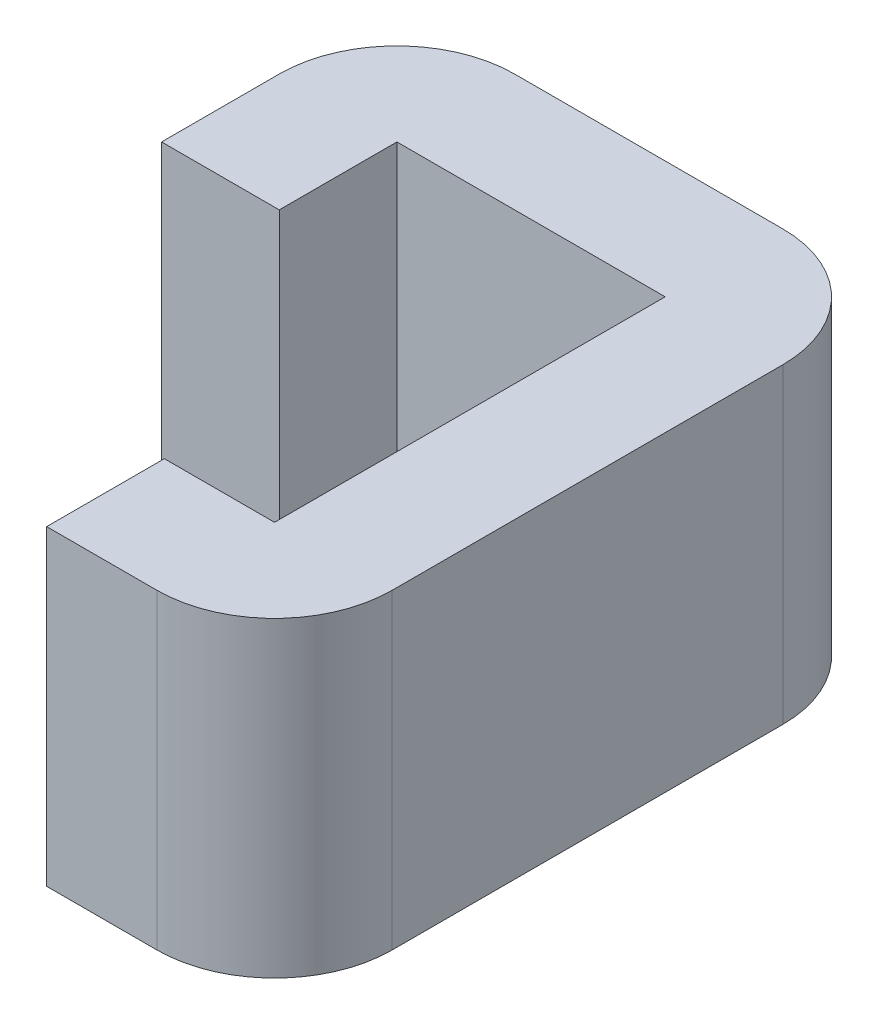
ISO-10303-21;
HEADER;
FILE_DESCRIPTION(('STEP AP214'),'2;1');
FILE_NAME('part.step','',(''),(''),'','','');
FILE_SCHEMA(('AUTOMOTIVE_DESIGN { 1 0 10303 214 1 1 1 1 }'));
ENDSEC;
DATA;
#1=APPLICATION_CONTEXT('core data for automotive mechanical design processes');
#2=APPLICATION_PROTOCOL_DEFINITION('international standard','automotive_design',2000,#1);
#3=PRODUCT_CONTEXT('',#1,'mechanical');
#4=PRODUCT('Part','Part','',(#3));
#5=PRODUCT_RELATED_PRODUCT_CATEGORY('part','',(#4));
#6=PRODUCT_DEFINITION_FORMATION('','',#4);
#7=PRODUCT_DEFINITION_CONTEXT('part definition',#1,'design');
#8=PRODUCT_DEFINITION('design','',#6,#7);
#9=PRODUCT_DEFINITION_SHAPE('','',#8);
#10=(LENGTH_UNIT() NAMED_UNIT(*) SI_UNIT(.MILLI.,.METRE.));
#11=(NAMED_UNIT(*) PLANE_ANGLE_UNIT() SI_UNIT($,.RADIAN.));
#12=(NAMED_UNIT(*) SI_UNIT($,.STERADIAN.) SOLID_ANGLE_UNIT());
#13=UNCERTAINTY_MEASURE_WITH_UNIT(LENGTH_MEASURE(1.E-05),#10,'distance_accuracy_value','');
#14=(GEOMETRIC_REPRESENTATION_CONTEXT(3) GLOBAL_UNCERTAINTY_ASSIGNED_CONTEXT((#13)) GLOBAL_UNIT_ASSIGNED_CONTEXT((#10,
#11,#12)) REPRESENTATION_CONTEXT('',''));
#15=CARTESIAN_POINT('',(0.,0.,0.));
#16=DIRECTION('',(0.,0.,1.));
#17=DIRECTION('',(1.,0.,0.));
#18=AXIS2_PLACEMENT_3D('',#15,#16,#17);
#19=CARTESIAN_POINT('',(0.285,2.236,0.25));
#20=DIRECTION('',(0.,1.,0.));
#21=DIRECTION('',(0.,0.,1.));
#22=AXIS2_PLACEMENT_3D('',#19,#20,#21);
#23=PLANE('',#22);
#24=DIRECTION('',(0.,0.,1.));
#25=VECTOR('',#24,1.);
#26=CARTESIAN_POINT('',(-0.285,2.236,0.5));
#27=LINE('',#26,#25);
#28=CARTESIAN_POINT('',(-0.285,2.236,0.5));
#29=VERTEX_POINT('',#28);
#30=CARTESIAN_POINT('',(-0.285,2.236,0.25));
#31=VERTEX_POINT('',#30);
#32=EDGE_CURVE('E181',#29,#31,#27,.F.);
#33=ORIENTED_EDGE('',*,*,#32,.T.);
#34=DIRECTION('',(-1.,0.,0.));
#35=VECTOR('',#34,1.);
#36=CARTESIAN_POINT('',(-0.285,2.236,0.25));
#37=LINE('',#36,#35);
#38=CARTESIAN_POINT('',(0.285,2.236,0.25));
#39=VERTEX_POINT('',#38);
#40=EDGE_CURVE('E168',#31,#39,#37,.F.);
#41=ORIENTED_EDGE('',*,*,#40,.T.);
#42=DIRECTION('',(0.,0.,-1.));
#43=VECTOR('',#42,1.);
#44=CARTESIAN_POINT('',(0.285,2.236,0.25));
#45=LINE('',#44,#43);
#46=CARTESIAN_POINT('',(0.285,2.236,1.08));
#47=VERTEX_POINT('',#46);
#48=EDGE_CURVE('E158',#39,#47,#45,.F.);
#49=ORIENTED_EDGE('',*,*,#48,.T.);
#50=DIRECTION('',(1.,0.,0.));
#51=VECTOR('',#50,1.);
#52=CARTESIAN_POINT('',(0.285,2.236,1.08));
#53=LINE('',#52,#51);
#54=CARTESIAN_POINT('',(0.0508,2.236,1.08));
#55=VERTEX_POINT('',#54);
#56=EDGE_CURVE('E147',#47,#55,#53,.F.);
#57=ORIENTED_EDGE('',*,*,#56,.T.);
#58=DIRECTION('',(0.,0.,-1.));
#59=VECTOR('',#58,1.);
#60=CARTESIAN_POINT('',(0.0508,2.236,1.08));
#61=LINE('',#60,#59);
#62=CARTESIAN_POINT('',(0.0508,2.236,1.33));
#63=VERTEX_POINT('',#62);
#64=EDGE_CURVE('E122',#55,#63,#61,.F.);
#65=ORIENTED_EDGE('',*,*,#64,.T.);
#66=DIRECTION('',(1.,0.,0.));
#67=VECTOR('',#66,1.);
#68=CARTESIAN_POINT('',(0.285,2.236,1.33));
#69=LINE('',#68,#67);
#70=CARTESIAN_POINT('',(0.285,2.236,1.33));
#71=VERTEX_POINT('',#70);
#72=EDGE_CURVE('E120',#71,#63,#69,.F.);
#73=ORIENTED_EDGE('',*,*,#72,.F.);
#74=CARTESIAN_POINT('',(0.285,2.236,1.08));
#75=DIRECTION('',(0.,-1.,0.));
#76=DIRECTION('',(0.,0.,-1.));
#77=AXIS2_PLACEMENT_3D('',#74,#75,#76);
#78=CIRCLE('',#77,0.25);
#79=CARTESIAN_POINT('',(0.535,2.236,1.08));
#80=VERTEX_POINT('',#79);
#81=EDGE_CURVE('E20',#80,#71,#78,.T.);
#82=ORIENTED_EDGE('',*,*,#81,.F.);
#83=DIRECTION('',(0.,0.,1.));
#84=VECTOR('',#83,1.);
#85=CARTESIAN_POINT('',(0.535,2.236,1.08));
#86=LINE('',#85,#84);
#87=CARTESIAN_POINT('',(0.535,2.236,0.25));
#88=VERTEX_POINT('',#87);
#89=EDGE_CURVE('E131',#80,#88,#86,.F.);
#90=ORIENTED_EDGE('',*,*,#89,.T.);
#91=CARTESIAN_POINT('',(0.285,2.236,0.25));
#92=DIRECTION('',(0.,-1.,0.));
#93=DIRECTION('',(0.,0.,-1.));
#94=AXIS2_PLACEMENT_3D('',#91,#92,#93);
#95=CIRCLE('',#94,0.25);
#96=CARTESIAN_POINT('',(0.285,2.236,0.));
#97=VERTEX_POINT('',#96);
#98=EDGE_CURVE('E212',#97,#88,#95,.T.);
#99=ORIENTED_EDGE('',*,*,#98,.F.);
#100=DIRECTION('',(1.,0.,0.));
#101=VECTOR('',#100,1.);
#102=CARTESIAN_POINT('',(0.285,2.236,0.));
#103=LINE('',#102,#101);
#104=CARTESIAN_POINT('',(-0.285,2.236,0.));
#105=VERTEX_POINT('',#104);
#106=EDGE_CURVE('E207',#97,#105,#103,.F.);
#107=ORIENTED_EDGE('',*,*,#106,.T.);
#108=CARTESIAN_POINT('',(-0.285,2.236,0.25));
#109=DIRECTION('',(0.,-1.,0.));
#110=DIRECTION('',(0.,0.,-1.));
#111=AXIS2_PLACEMENT_3D('',#108,#109,#110);
#112=CIRCLE('',#111,0.25);
#113=CARTESIAN_POINT('',(-0.535,2.236,0.25));
#114=VERTEX_POINT('',#113);
#115=EDGE_CURVE('E210',#114,#105,#112,.T.);
#116=ORIENTED_EDGE('',*,*,#115,.F.);
#117=DIRECTION('',(0.,0.,-1.));
#118=VECTOR('',#117,1.);
#119=CARTESIAN_POINT('',(-0.535,2.236,0.25));
#120=LINE('',#119,#118);
#121=CARTESIAN_POINT('',(-0.535,2.236,0.5));
#122=VERTEX_POINT('',#121);
#123=EDGE_CURVE('E202',#114,#122,#120,.F.);
#124=ORIENTED_EDGE('',*,*,#123,.T.);
#125=DIRECTION('',(-1.,0.,0.));
#126=VECTOR('',#125,1.);
#127=CARTESIAN_POINT('',(-0.535,2.236,0.5));
#128=LINE('',#127,#126);
#129=EDGE_CURVE('E195',#122,#29,#128,.F.);
#130=ORIENTED_EDGE('',*,*,#129,.T.);
#131=EDGE_LOOP('',(#33,#41,#49,#57,#65,#73,#82,#90,#99,#107,#116,#124,#130));
#132=FACE_BOUND('',#131,.T.);
#133=ADVANCED_FACE('F17',(#132),#23,.T.);
#134=CARTESIAN_POINT('',(0.285,1.574,0.25));
#135=DIRECTION('',(1.,0.,0.));
#136=DIRECTION('',(0.,0.,-1.));
#137=AXIS2_PLACEMENT_3D('',#134,#135,#136);
#138=PLANE('',#137);
#139=DIRECTION('',(0.,1.,0.));
#140=VECTOR('',#139,1.);
#141=CARTESIAN_POINT('',(0.285,1.574,1.08));
#142=LINE('',#141,#140);
#143=CARTESIAN_POINT('',(0.285,1.574,1.08));
#144=VERTEX_POINT('',#143);
#145=EDGE_CURVE('E155',#144,#47,#142,.T.);
#146=ORIENTED_EDGE('',*,*,#145,.T.);
#147=ORIENTED_EDGE('',*,*,#48,.F.);
#148=DIRECTION('',(0.,1.,0.));
#149=VECTOR('',#148,1.);
#150=CARTESIAN_POINT('',(0.285,1.574,0.25));
#151=LINE('',#150,#149);
#152=CARTESIAN_POINT('',(0.285,1.574,0.25));
#153=VERTEX_POINT('',#152);
#154=EDGE_CURVE('E163',#39,#153,#151,.F.);
#155=ORIENTED_EDGE('',*,*,#154,.T.);
#156=DIRECTION('',(0.,0.,1.));
#157=VECTOR('',#156,1.);
#158=CARTESIAN_POINT('',(0.285,1.574,0.25));
#159=LINE('',#158,#157);
#160=EDGE_CURVE('E152',#153,#144,#159,.T.);
#161=ORIENTED_EDGE('',*,*,#160,.T.);
#162=EDGE_LOOP('',(#146,#147,#155,#161));
#163=FACE_BOUND('',#162,.T.);
#164=ADVANCED_FACE('F395',(#163),#138,.F.);
#165=CARTESIAN_POINT('',(0.285,1.574,1.08));
#166=DIRECTION('',(0.,0.,1.));
#167=DIRECTION('',(1.,0.,0.));
#168=AXIS2_PLACEMENT_3D('',#165,#166,#167);
#169=PLANE('',#168);
#170=DIRECTION('',(0.,1.,0.));
#171=VECTOR('',#170,1.);
#172=CARTESIAN_POINT('',(0.0508,1.574,1.08));
#173=LINE('',#172,#171);
#174=CARTESIAN_POINT('',(0.0508,1.574,1.08));
#175=VERTEX_POINT('',#174);
#176=EDGE_CURVE('E144',#175,#55,#173,.T.);
#177=ORIENTED_EDGE('',*,*,#176,.T.);
#178=ORIENTED_EDGE('',*,*,#56,.F.);
#179=ORIENTED_EDGE('',*,*,#145,.F.);
#180=DIRECTION('',(1.,0.,0.));
#181=VECTOR('',#180,1.);
#182=CARTESIAN_POINT('',(0.285,1.574,1.08));
#183=LINE('',#182,#181);
#184=EDGE_CURVE('E141',#144,#175,#183,.F.);
#185=ORIENTED_EDGE('',*,*,#184,.T.);
#186=EDGE_LOOP('',(#177,#178,#179,#185));
#187=FACE_BOUND('',#186,.T.);
#188=ADVANCED_FACE('F385',(#187),#169,.F.);
#189=CARTESIAN_POINT('',(0.0508,1.574,1.08));
#190=DIRECTION('',(1.,0.,0.));
#191=DIRECTION('',(0.,0.,-1.));
#192=AXIS2_PLACEMENT_3D('',#189,#190,#191);
#193=PLANE('',#192);
#194=DIRECTION('',(0.,1.,0.));
#195=VECTOR('',#194,1.);
#196=CARTESIAN_POINT('',(0.0508,1.574,1.33));
#197=LINE('',#196,#195);
#198=CARTESIAN_POINT('',(0.0508,1.574,1.33));
#199=VERTEX_POINT('',#198);
#200=EDGE_CURVE('E118',#63,#199,#197,.F.);
#201=ORIENTED_EDGE('',*,*,#200,.F.);
#202=ORIENTED_EDGE('',*,*,#64,.F.);
#203=ORIENTED_EDGE('',*,*,#176,.F.);
#204=DIRECTION('',(0.,0.,1.));
#205=VECTOR('',#204,1.);
#206=CARTESIAN_POINT('',(0.0508,1.574,0.25));
#207=LINE('',#206,#205);
#208=EDGE_CURVE('E138',#175,#199,#207,.T.);
#209=ORIENTED_EDGE('',*,*,#208,.T.);
#210=EDGE_LOOP('',(#201,#202,#203,#209));
#211=FACE_BOUND('',#210,.T.);
#212=ADVANCED_FACE('F376',(#211),#193,.F.);
#213=CARTESIAN_POINT('',(0.285,1.574,1.33));
#214=DIRECTION('',(0.,0.,1.));
#215=DIRECTION('',(1.,0.,0.));
#216=AXIS2_PLACEMENT_3D('',#213,#214,#215);
#217=PLANE('',#216);
#218=ORIENTED_EDGE('',*,*,#200,.T.);
#219=DIRECTION('',(1.,0.,0.));
#220=VECTOR('',#219,1.);
#221=CARTESIAN_POINT('',(0.285,1.574,1.33));
#222=LINE('',#221,#220);
#223=CARTESIAN_POINT('',(0.285,1.574,1.33));
#224=VERTEX_POINT('',#223);
#225=EDGE_CURVE('E129',#199,#224,#222,.T.);
#226=ORIENTED_EDGE('',*,*,#225,.T.);
#227=DIRECTION('',(0.,-1.,0.));
#228=VECTOR('',#227,1.);
#229=CARTESIAN_POINT('',(0.285,1.574,1.33));
#230=LINE('',#229,#228);
#231=EDGE_CURVE('E115',#71,#224,#230,.T.);
#232=ORIENTED_EDGE('',*,*,#231,.F.);
#233=ORIENTED_EDGE('',*,*,#72,.T.);
#234=EDGE_LOOP('',(#218,#226,#232,#233));
#235=FACE_BOUND('',#234,.T.);
#236=ADVANCED_FACE('F127',(#235),#217,.T.);
#237=CARTESIAN_POINT('',(0.285,1.574,1.08));
#238=DIRECTION('',(0.,-1.,0.));
#239=DIRECTION('',(0.,0.,-1.));
#240=AXIS2_PLACEMENT_3D('',#237,#238,#239);
#241=CYLINDRICAL_SURFACE('',#240,0.25);
#242=ORIENTED_EDGE('',*,*,#81,.T.);
#243=ORIENTED_EDGE('',*,*,#231,.T.);
#244=CARTESIAN_POINT('',(0.285,1.574,1.08));
#245=DIRECTION('',(0.,-1.,0.));
#246=DIRECTION('',(0.,0.,-1.));
#247=AXIS2_PLACEMENT_3D('',#244,#245,#246);
#248=CIRCLE('',#247,0.25);
#249=CARTESIAN_POINT('',(0.535,1.574,1.08));
#250=VERTEX_POINT('',#249);
#251=EDGE_CURVE('E231',#224,#250,#248,.F.);
#252=ORIENTED_EDGE('',*,*,#251,.T.);
#253=DIRECTION('',(0.,1.,0.));
#254=VECTOR('',#253,1.);
#255=CARTESIAN_POINT('',(0.535,1.574,1.08));
#256=LINE('',#255,#254);
#257=EDGE_CURVE('E117',#250,#80,#256,.T.);
#258=ORIENTED_EDGE('',*,*,#257,.T.);
#259=EDGE_LOOP('',(#242,#243,#252,#258));
#260=FACE_BOUND('',#259,.T.);
#261=ADVANCED_FACE('F112',(#260),#241,.T.);
#262=CARTESIAN_POINT('',(0.535,1.574,1.08));
#263=DIRECTION('',(-1.,0.,0.));
#264=DIRECTION('',(0.,0.,1.));
#265=AXIS2_PLACEMENT_3D('',#262,#263,#264);
#266=PLANE('',#265);
#267=DIRECTION('',(0.,-1.,0.));
#268=VECTOR('',#267,1.);
#269=CARTESIAN_POINT('',(0.535,1.574,0.25));
#270=LINE('',#269,#268);
#271=CARTESIAN_POINT('',(0.535,1.574,0.25));
#272=VERTEX_POINT('',#271);
#273=EDGE_CURVE('E234',#88,#272,#270,.T.);
#274=ORIENTED_EDGE('',*,*,#273,.F.);
#275=ORIENTED_EDGE('',*,*,#89,.F.);
#276=ORIENTED_EDGE('',*,*,#257,.F.);
#277=DIRECTION('',(0.,0.,1.));
#278=VECTOR('',#277,1.);
#279=CARTESIAN_POINT('',(0.535,1.574,0.25));
#280=LINE('',#279,#278);
#281=EDGE_CURVE('E230',#250,#272,#280,.F.);
#282=ORIENTED_EDGE('',*,*,#281,.T.);
#283=EDGE_LOOP('',(#274,#275,#276,#282));
#284=FACE_BOUND('',#283,.T.);
#285=ADVANCED_FACE('F281',(#284),#266,.F.);
#286=CARTESIAN_POINT('',(0.285,1.574,0.25));
#287=DIRECTION('',(0.,-1.,0.));
#288=DIRECTION('',(0.,0.,-1.));
#289=AXIS2_PLACEMENT_3D('',#286,#287,#288);
#290=CYLINDRICAL_SURFACE('',#289,0.25);
#291=ORIENTED_EDGE('',*,*,#98,.T.);
#292=ORIENTED_EDGE('',*,*,#273,.T.);
#293=CARTESIAN_POINT('',(0.285,1.574,0.25));
#294=DIRECTION('',(0.,-1.,0.));
#295=DIRECTION('',(0.,0.,-1.));
#296=AXIS2_PLACEMENT_3D('',#293,#294,#295);
#297=CIRCLE('',#296,0.25);
#298=CARTESIAN_POINT('',(0.285,1.574,0.));
#299=VERTEX_POINT('',#298);
#300=EDGE_CURVE('E227',#272,#299,#297,.F.);
#301=ORIENTED_EDGE('',*,*,#300,.T.);
#302=DIRECTION('',(0.,1.,0.));
#303=VECTOR('',#302,1.);
#304=CARTESIAN_POINT('',(0.285,1.574,0.));
#305=LINE('',#304,#303);
#306=EDGE_CURVE('E211',#299,#97,#305,.T.);
#307=ORIENTED_EDGE('',*,*,#306,.T.);
#308=EDGE_LOOP('',(#291,#292,#301,#307));
#309=FACE_BOUND('',#308,.T.);
#310=ADVANCED_FACE('F279',(#309),#290,.T.);
#311=CARTESIAN_POINT('',(0.285,1.574,0.));
#312=DIRECTION('',(0.,0.,1.));
#313=DIRECTION('',(1.,0.,0.));
#314=AXIS2_PLACEMENT_3D('',#311,#312,#313);
#315=PLANE('',#314);
#316=DIRECTION('',(0.,-1.,0.));
#317=VECTOR('',#316,1.);
#318=CARTESIAN_POINT('',(-0.285,1.574,0.));
#319=LINE('',#318,#317);
#320=CARTESIAN_POINT('',(-0.285,1.574,0.));
#321=VERTEX_POINT('',#320);
#322=EDGE_CURVE('E233',#105,#321,#319,.T.);
#323=ORIENTED_EDGE('',*,*,#322,.F.);
#324=ORIENTED_EDGE('',*,*,#106,.F.);
#325=ORIENTED_EDGE('',*,*,#306,.F.);
#326=DIRECTION('',(1.,0.,0.));
#327=VECTOR('',#326,1.);
#328=CARTESIAN_POINT('',(0.285,1.574,0.));
#329=LINE('',#328,#327);
#330=EDGE_CURVE('E226',#299,#321,#329,.F.);
#331=ORIENTED_EDGE('',*,*,#330,.T.);
#332=EDGE_LOOP('',(#323,#324,#325,#331));
#333=FACE_BOUND('',#332,.T.);
#334=ADVANCED_FACE('F277',(#333),#315,.F.);
#335=CARTESIAN_POINT('',(-0.285,1.574,0.25));
#336=DIRECTION('',(0.,-1.,0.));
#337=DIRECTION('',(0.,0.,-1.));
#338=AXIS2_PLACEMENT_3D('',#335,#336,#337);
#339=CYLINDRICAL_SURFACE('',#338,0.25);
#340=ORIENTED_EDGE('',*,*,#115,.T.);
#341=ORIENTED_EDGE('',*,*,#322,.T.);
#342=CARTESIAN_POINT('',(-0.285,1.574,0.25));
#343=DIRECTION('',(0.,-1.,0.));
#344=DIRECTION('',(0.,0.,-1.));
#345=AXIS2_PLACEMENT_3D('',#342,#343,#344);
#346=CIRCLE('',#345,0.25);
#347=CARTESIAN_POINT('',(-0.535,1.574,0.25));
#348=VERTEX_POINT('',#347);
#349=EDGE_CURVE('E222',#321,#348,#346,.F.);
#350=ORIENTED_EDGE('',*,*,#349,.T.);
#351=DIRECTION('',(0.,1.,0.));
#352=VECTOR('',#351,1.);
#353=CARTESIAN_POINT('',(-0.535,1.574,0.25));
#354=LINE('',#353,#352);
#355=EDGE_CURVE('E204',#348,#114,#354,.T.);
#356=ORIENTED_EDGE('',*,*,#355,.T.);
#357=EDGE_LOOP('',(#340,#341,#350,#356));
#358=FACE_BOUND('',#357,.T.);
#359=ADVANCED_FACE('F273',(#358),#339,.T.);
#360=CARTESIAN_POINT('',(-0.535,1.574,0.25));
#361=DIRECTION('',(1.,0.,0.));
#362=DIRECTION('',(0.,0.,-1.));
#363=AXIS2_PLACEMENT_3D('',#360,#361,#362);
#364=PLANE('',#363);
#365=DIRECTION('',(0.,1.,0.));
#366=VECTOR('',#365,1.);
#367=CARTESIAN_POINT('',(-0.535,1.574,0.5));
#368=LINE('',#367,#366);
#369=CARTESIAN_POINT('',(-0.535,1.574,0.5));
#370=VERTEX_POINT('',#369);
#371=EDGE_CURVE('E199',#370,#122,#368,.T.);
#372=ORIENTED_EDGE('',*,*,#371,.T.);
#373=ORIENTED_EDGE('',*,*,#123,.F.);
#374=ORIENTED_EDGE('',*,*,#355,.F.);
#375=DIRECTION('',(0.,0.,1.));
#376=VECTOR('',#375,1.);
#377=CARTESIAN_POINT('',(-0.535,1.574,0.25));
#378=LINE('',#377,#376);
#379=EDGE_CURVE('E225',#348,#370,#378,.T.);
#380=ORIENTED_EDGE('',*,*,#379,.T.);
#381=EDGE_LOOP('',(#372,#373,#374,#380));
#382=FACE_BOUND('',#381,.T.);
#383=ADVANCED_FACE('F264',(#382),#364,.F.);
#384=CARTESIAN_POINT('',(-0.535,1.574,0.5));
#385=DIRECTION('',(0.,0.,-1.));
#386=DIRECTION('',(-1.,0.,0.));
#387=AXIS2_PLACEMENT_3D('',#384,#385,#386);
#388=PLANE('',#387);
#389=DIRECTION('',(0.,1.,0.));
#390=VECTOR('',#389,1.);
#391=CARTESIAN_POINT('',(-0.285,1.574,0.5));
#392=LINE('',#391,#390);
#393=CARTESIAN_POINT('',(-0.285,1.574,0.5));
#394=VERTEX_POINT('',#393);
#395=EDGE_CURVE('E185',#394,#29,#392,.T.);
#396=ORIENTED_EDGE('',*,*,#395,.T.);
#397=ORIENTED_EDGE('',*,*,#129,.F.);
#398=ORIENTED_EDGE('',*,*,#371,.F.);
#399=DIRECTION('',(1.,0.,0.));
#400=VECTOR('',#399,1.);
#401=CARTESIAN_POINT('',(0.285,1.574,0.5));
#402=LINE('',#401,#400);
#403=EDGE_CURVE('E190',#370,#394,#402,.T.);
#404=ORIENTED_EDGE('',*,*,#403,.T.);
#405=EDGE_LOOP('',(#396,#397,#398,#404));
#406=FACE_BOUND('',#405,.T.);
#407=ADVANCED_FACE('F304',(#406),#388,.F.);
#408=CARTESIAN_POINT('',(-0.285,1.574,0.5));
#409=DIRECTION('',(-1.,0.,0.));
#410=DIRECTION('',(0.,0.,1.));
#411=AXIS2_PLACEMENT_3D('',#408,#409,#410);
#412=PLANE('',#411);
#413=DIRECTION('',(0.,1.,0.));
#414=VECTOR('',#413,1.);
#415=CARTESIAN_POINT('',(-0.285,1.574,0.25));
#416=LINE('',#415,#414);
#417=CARTESIAN_POINT('',(-0.285,1.574,0.25));
#418=VERTEX_POINT('',#417);
#419=EDGE_CURVE('E34',#418,#31,#416,.T.);
#420=ORIENTED_EDGE('',*,*,#419,.T.);
#421=ORIENTED_EDGE('',*,*,#32,.F.);
#422=ORIENTED_EDGE('',*,*,#395,.F.);
#423=DIRECTION('',(0.,0.,1.));
#424=VECTOR('',#423,1.);
#425=CARTESIAN_POINT('',(-0.285,1.574,0.25));
#426=LINE('',#425,#424);
#427=EDGE_CURVE('E26',#394,#418,#426,.F.);
#428=ORIENTED_EDGE('',*,*,#427,.T.);
#429=EDGE_LOOP('',(#420,#421,#422,#428));
#430=FACE_BOUND('',#429,.T.);
#431=ADVANCED_FACE('F299',(#430),#412,.F.);
#432=CARTESIAN_POINT('',(-0.285,1.574,0.25));
#433=DIRECTION('',(0.,0.,-1.));
#434=DIRECTION('',(-1.,0.,0.));
#435=AXIS2_PLACEMENT_3D('',#432,#433,#434);
#436=PLANE('',#435);
#437=ORIENTED_EDGE('',*,*,#154,.F.);
#438=ORIENTED_EDGE('',*,*,#40,.F.);
#439=ORIENTED_EDGE('',*,*,#419,.F.);
#440=DIRECTION('',(1.,0.,0.));
#441=VECTOR('',#440,1.);
#442=CARTESIAN_POINT('',(0.285,1.574,0.25));
#443=LINE('',#442,#441);
#444=EDGE_CURVE('E11',#418,#153,#443,.T.);
#445=ORIENTED_EDGE('',*,*,#444,.T.);
#446=EDGE_LOOP('',(#437,#438,#439,#445));
#447=FACE_BOUND('',#446,.T.);
#448=ADVANCED_FACE('F293',(#447),#436,.F.);
#449=CARTESIAN_POINT('',(0.285,1.574,0.25));
#450=DIRECTION('',(0.,1.,0.));
#451=DIRECTION('',(0.,0.,1.));
#452=AXIS2_PLACEMENT_3D('',#449,#450,#451);
#453=PLANE('',#452);
#454=ORIENTED_EDGE('',*,*,#427,.F.);
#455=ORIENTED_EDGE('',*,*,#403,.F.);
#456=ORIENTED_EDGE('',*,*,#379,.F.);
#457=ORIENTED_EDGE('',*,*,#349,.F.);
#458=ORIENTED_EDGE('',*,*,#330,.F.);
#459=ORIENTED_EDGE('',*,*,#300,.F.);
#460=ORIENTED_EDGE('',*,*,#281,.F.);
#461=ORIENTED_EDGE('',*,*,#251,.F.);
#462=ORIENTED_EDGE('',*,*,#225,.F.);
#463=ORIENTED_EDGE('',*,*,#208,.F.);
#464=ORIENTED_EDGE('',*,*,#184,.F.);
#465=ORIENTED_EDGE('',*,*,#160,.F.);
#466=ORIENTED_EDGE('',*,*,#444,.F.);
#467=EDGE_LOOP('',(#454,#455,#456,#457,#458,#459,#460,#461,#462,#463,#464,#465,#466));
#468=FACE_BOUND('',#467,.T.);
#469=ADVANCED_FACE('F270',(#468),#453,.F.);
#470=CLOSED_SHELL('',(#133,#164,#188,#212,#236,#261,#285,#310,#334,#359,#383,#407,#431,#448,#469));
#471=MANIFOLD_SOLID_BREP('B1',#470);
#472=ADVANCED_BREP_SHAPE_REPRESENTATION('',(#18,#471),#14);
#473=SHAPE_DEFINITION_REPRESENTATION(#9,#472);
ENDSEC;
END-ISO-10303-21;
